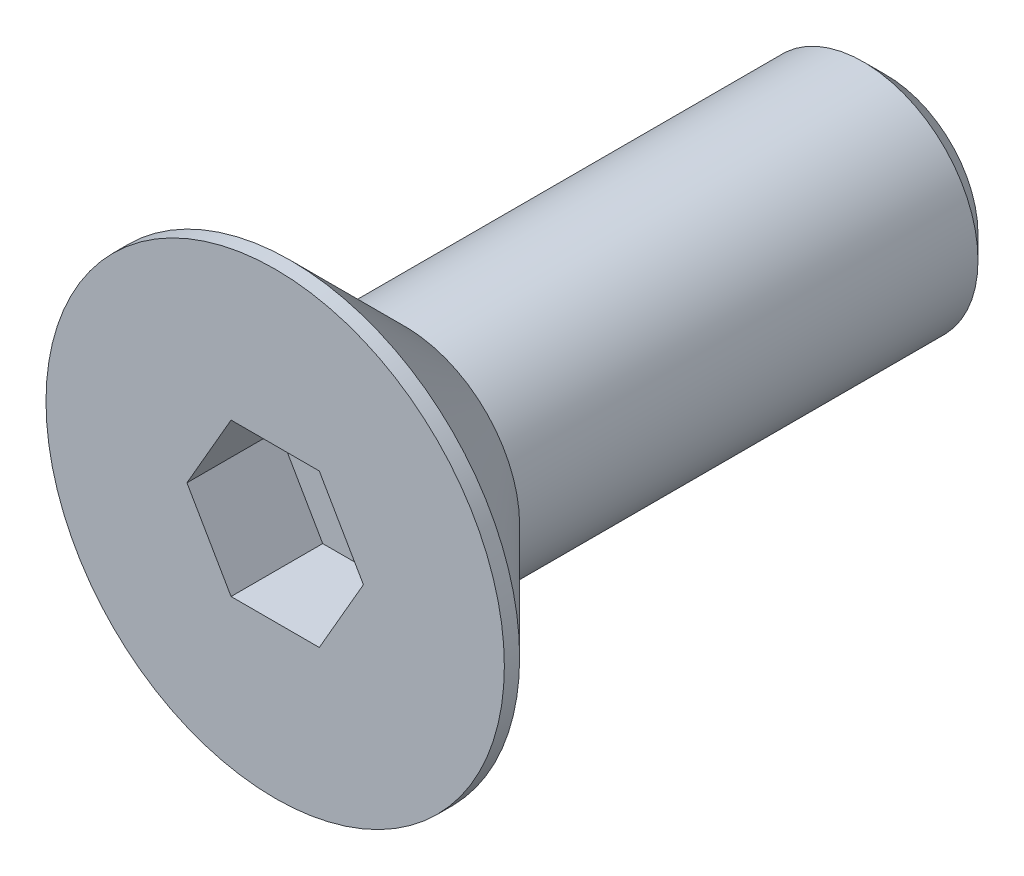
ISO-10303-21;
HEADER;
FILE_DESCRIPTION(('STEP AP214'),'2;1');
FILE_NAME('part.step','',(''),(''),'','','');
FILE_SCHEMA(('AUTOMOTIVE_DESIGN { 1 0 10303 214 1 1 1 1 }'));
ENDSEC;
DATA;
#1=APPLICATION_CONTEXT('core data for automotive mechanical design processes');
#2=APPLICATION_PROTOCOL_DEFINITION('international standard','automotive_design',2000,#1);
#3=PRODUCT_CONTEXT('',#1,'mechanical');
#4=PRODUCT('Part','Part','',(#3));
#5=PRODUCT_RELATED_PRODUCT_CATEGORY('part','',(#4));
#6=PRODUCT_DEFINITION_FORMATION('','',#4);
#7=PRODUCT_DEFINITION_CONTEXT('part definition',#1,'design');
#8=PRODUCT_DEFINITION('design','',#6,#7);
#9=PRODUCT_DEFINITION_SHAPE('','',#8);
#10=(LENGTH_UNIT() NAMED_UNIT(*) SI_UNIT(.MILLI.,.METRE.));
#11=(NAMED_UNIT(*) PLANE_ANGLE_UNIT() SI_UNIT($,.RADIAN.));
#12=(NAMED_UNIT(*) SI_UNIT($,.STERADIAN.) SOLID_ANGLE_UNIT());
#13=UNCERTAINTY_MEASURE_WITH_UNIT(LENGTH_MEASURE(1.E-05),#10,'distance_accuracy_value','');
#14=(GEOMETRIC_REPRESENTATION_CONTEXT(3) GLOBAL_UNCERTAINTY_ASSIGNED_CONTEXT((#13)) GLOBAL_UNIT_ASSIGNED_CONTEXT((#10,
#11,#12)) REPRESENTATION_CONTEXT('',''));
#15=CARTESIAN_POINT('',(0.,0.,0.));
#16=DIRECTION('',(0.,0.,1.));
#17=DIRECTION('',(1.,0.,0.));
#18=AXIS2_PLACEMENT_3D('',#15,#16,#17);
#19=CARTESIAN_POINT('',(0.,0.,-6.3));
#20=DIRECTION('',(0.,0.,1.));
#21=DIRECTION('',(1.,0.,0.));
#22=AXIS2_PLACEMENT_3D('',#19,#20,#21);
#23=PLANE('',#22);
#24=CARTESIAN_POINT('',(0.,0.,-6.3));
#25=DIRECTION('',(0.,0.,1.));
#26=DIRECTION('',(1.,0.,0.));
#27=AXIS2_PLACEMENT_3D('',#24,#25,#26);
#28=CIRCLE('',#27,1.2);
#29=CARTESIAN_POINT('',(1.2,0.,-6.3));
#30=VERTEX_POINT('',#29);
#31=EDGE_CURVE('E25',#30,#30,#28,.T.);
#32=ORIENTED_EDGE('',*,*,#31,.F.);
#33=EDGE_LOOP('',(#32));
#34=FACE_BOUND('',#33,.T.);
#35=ADVANCED_FACE('F16',(#34),#23,.F.);
#36=CARTESIAN_POINT('',(0.,0.,-6.3));
#37=DIRECTION('',(0.,0.,1.));
#38=DIRECTION('',(1.,0.,0.));
#39=AXIS2_PLACEMENT_3D('',#36,#37,#38);
#40=CONICAL_SURFACE('',#39,1.2,0.785398163397);
#41=ORIENTED_EDGE('',*,*,#31,.T.);
#42=DIRECTION('',(0.707106781186548,0.,0.707106781186548));
#43=VECTOR('',#42,1.);
#44=CARTESIAN_POINT('',(1.2,0.,-6.3));
#45=LINE('',#44,#43);
#46=CARTESIAN_POINT('',(1.5,0.,-6.));
#47=VERTEX_POINT('',#46);
#48=EDGE_CURVE('E11',#30,#47,#45,.T.);
#49=ORIENTED_EDGE('',*,*,#48,.T.);
#50=CARTESIAN_POINT('',(0.,0.,-6.));
#51=DIRECTION('',(0.,0.,1.));
#52=DIRECTION('',(1.,0.,0.));
#53=AXIS2_PLACEMENT_3D('',#50,#51,#52);
#54=CIRCLE('',#53,1.5);
#55=EDGE_CURVE('E105',#47,#47,#54,.T.);
#56=ORIENTED_EDGE('',*,*,#55,.F.);
#57=ORIENTED_EDGE('',*,*,#48,.F.);
#58=EDGE_LOOP('',(#41,#49,#56,#57));
#59=FACE_BOUND('',#58,.T.);
#60=ADVANCED_FACE('F127',(#59),#40,.T.);
#61=CARTESIAN_POINT('',(0.,0.,-6.));
#62=DIRECTION('',(0.,0.,1.));
#63=DIRECTION('',(1.,0.,0.));
#64=AXIS2_PLACEMENT_3D('',#61,#62,#63);
#65=CYLINDRICAL_SURFACE('',#64,1.5);
#66=ORIENTED_EDGE('',*,*,#55,.T.);
#67=DIRECTION('',(0.,0.,1.));
#68=VECTOR('',#67,1.);
#69=CARTESIAN_POINT('',(1.5,0.,-6.));
#70=LINE('',#69,#68);
#71=CARTESIAN_POINT('',(1.5,0.,0.));
#72=VERTEX_POINT('',#71);
#73=EDGE_CURVE('E100',#47,#72,#70,.T.);
#74=ORIENTED_EDGE('',*,*,#73,.T.);
#75=CARTESIAN_POINT('',(0.,0.,0.));
#76=DIRECTION('',(0.,0.,1.));
#77=DIRECTION('',(1.,0.,0.));
#78=AXIS2_PLACEMENT_3D('',#75,#76,#77);
#79=CIRCLE('',#78,1.5);
#80=EDGE_CURVE('E103',#72,#72,#79,.T.);
#81=ORIENTED_EDGE('',*,*,#80,.F.);
#82=ORIENTED_EDGE('',*,*,#73,.F.);
#83=EDGE_LOOP('',(#66,#74,#81,#82));
#84=FACE_BOUND('',#83,.T.);
#85=ADVANCED_FACE('F102',(#84),#65,.T.);
#86=CARTESIAN_POINT('',(0.,0.,0.5));
#87=DIRECTION('',(0.,0.,1.));
#88=DIRECTION('',(1.,0.,0.));
#89=AXIS2_PLACEMENT_3D('',#86,#87,#88);
#90=PLANE('',#89);
#91=DIRECTION('',(-0.50000000000019,0.866025403784329,0.));
#92=VECTOR('',#91,1.);
#93=CARTESIAN_POINT('',(1.155,0.,0.5));
#94=LINE('',#93,#92);
#95=CARTESIAN_POINT('',(1.155,0.,0.5));
#96=VERTEX_POINT('',#95);
#97=CARTESIAN_POINT('',(0.5775,1.000259341371,0.5));
#98=VERTEX_POINT('',#97);
#99=EDGE_CURVE('E120',#96,#98,#94,.T.);
#100=ORIENTED_EDGE('',*,*,#99,.T.);
#101=DIRECTION('',(-1.,0.,0.));
#102=VECTOR('',#101,1.);
#103=CARTESIAN_POINT('',(0.5775,1.000259341371,0.5));
#104=LINE('',#103,#102);
#105=CARTESIAN_POINT('',(-0.5775,1.000259341371,0.5));
#106=VERTEX_POINT('',#105);
#107=EDGE_CURVE('E159',#98,#106,#104,.T.);
#108=ORIENTED_EDGE('',*,*,#107,.T.);
#109=DIRECTION('',(-0.50000000000019,-0.866025403784329,0.));
#110=VECTOR('',#109,1.);
#111=CARTESIAN_POINT('',(-0.5775,1.000259341371,0.5));
#112=LINE('',#111,#110);
#113=CARTESIAN_POINT('',(-1.155,0.,0.5));
#114=VERTEX_POINT('',#113);
#115=EDGE_CURVE('E176',#106,#114,#112,.T.);
#116=ORIENTED_EDGE('',*,*,#115,.T.);
#117=DIRECTION('',(0.50000000000019,-0.866025403784329,0.));
#118=VECTOR('',#117,1.);
#119=CARTESIAN_POINT('',(-1.155,0.,0.5));
#120=LINE('',#119,#118);
#121=CARTESIAN_POINT('',(-0.5775,-1.000259341371,0.5));
#122=VERTEX_POINT('',#121);
#123=EDGE_CURVE('E183',#114,#122,#120,.T.);
#124=ORIENTED_EDGE('',*,*,#123,.T.);
#125=DIRECTION('',(1.,0.,0.));
#126=VECTOR('',#125,1.);
#127=CARTESIAN_POINT('',(-0.5775,-1.000259341371,0.5));
#128=LINE('',#127,#126);
#129=CARTESIAN_POINT('',(0.5775,-1.000259341371,0.5));
#130=VERTEX_POINT('',#129);
#131=EDGE_CURVE('E187',#122,#130,#128,.T.);
#132=ORIENTED_EDGE('',*,*,#131,.T.);
#133=DIRECTION('',(0.50000000000019,0.866025403784329,0.));
#134=VECTOR('',#133,1.);
#135=CARTESIAN_POINT('',(0.5775,-1.000259341371,0.5));
#136=LINE('',#135,#134);
#137=EDGE_CURVE('E162',#130,#96,#136,.T.);
#138=ORIENTED_EDGE('',*,*,#137,.T.);
#139=EDGE_LOOP('',(#100,#108,#116,#124,#132,#138));
#140=FACE_BOUND('',#139,.T.);
#141=ADVANCED_FACE('F138',(#140),#90,.T.);
#142=CARTESIAN_POINT('',(0.,0.,1.5));
#143=DIRECTION('',(0.,0.,1.));
#144=DIRECTION('',(1.,0.,0.));
#145=AXIS2_PLACEMENT_3D('',#142,#143,#144);
#146=CONICAL_SURFACE('',#145,3.,0.785398163397);
#147=DIRECTION('',(-0.707106781186548,0.,-0.707106781186548));
#148=VECTOR('',#147,1.);
#149=CARTESIAN_POINT('',(3.,0.,1.5));
#150=LINE('',#149,#148);
#151=CARTESIAN_POINT('',(3.,0.,1.5));
#152=VERTEX_POINT('',#151);
#153=EDGE_CURVE('E111',#152,#72,#150,.T.);
#154=ORIENTED_EDGE('',*,*,#153,.T.);
#155=ORIENTED_EDGE('',*,*,#80,.T.);
#156=ORIENTED_EDGE('',*,*,#153,.F.);
#157=CARTESIAN_POINT('',(0.,0.,1.5));
#158=DIRECTION('',(0.,0.,1.));
#159=DIRECTION('',(1.,0.,0.));
#160=AXIS2_PLACEMENT_3D('',#157,#158,#159);
#161=CIRCLE('',#160,3.);
#162=EDGE_CURVE('E197',#152,#152,#161,.T.);
#163=ORIENTED_EDGE('',*,*,#162,.F.);
#164=EDGE_LOOP('',(#154,#155,#156,#163));
#165=FACE_BOUND('',#164,.T.);
#166=ADVANCED_FACE('F109',(#165),#146,.T.);
#167=CARTESIAN_POINT('',(1.155,0.,0.5));
#168=DIRECTION('',(-0.866025403784329,-0.50000000000019,0.));
#169=DIRECTION('',(-0.50000000000019,0.866025403784329,0.));
#170=AXIS2_PLACEMENT_3D('',#167,#168,#169);
#171=PLANE('',#170);
#172=DIRECTION('',(0.,0.,1.));
#173=VECTOR('',#172,1.);
#174=CARTESIAN_POINT('',(1.155,0.,0.5));
#175=LINE('',#174,#173);
#176=CARTESIAN_POINT('',(1.155,0.,1.7));
#177=VERTEX_POINT('',#176);
#178=EDGE_CURVE('E196',#96,#177,#175,.T.);
#179=ORIENTED_EDGE('',*,*,#178,.T.);
#180=DIRECTION('',(-0.50000000000019,0.866025403784329,0.));
#181=VECTOR('',#180,1.);
#182=CARTESIAN_POINT('',(1.155,0.,1.7));
#183=LINE('',#182,#181);
#184=CARTESIAN_POINT('',(0.5775,1.000259341371,1.7));
#185=VERTEX_POINT('',#184);
#186=EDGE_CURVE('E173',#177,#185,#183,.T.);
#187=ORIENTED_EDGE('',*,*,#186,.T.);
#188=DIRECTION('',(0.,0.,1.));
#189=VECTOR('',#188,1.);
#190=CARTESIAN_POINT('',(0.5775,1.000259341371,0.5));
#191=LINE('',#190,#189);
#192=EDGE_CURVE('E167',#98,#185,#191,.T.);
#193=ORIENTED_EDGE('',*,*,#192,.F.);
#194=ORIENTED_EDGE('',*,*,#99,.F.);
#195=EDGE_LOOP('',(#179,#187,#193,#194));
#196=FACE_BOUND('',#195,.T.);
#197=ADVANCED_FACE('F147',(#196),#171,.T.);
#198=CARTESIAN_POINT('',(0.5775,1.000259341371,0.5));
#199=DIRECTION('',(0.,-1.,0.));
#200=DIRECTION('',(-1.,0.,0.));
#201=AXIS2_PLACEMENT_3D('',#198,#199,#200);
#202=PLANE('',#201);
#203=ORIENTED_EDGE('',*,*,#192,.T.);
#204=DIRECTION('',(-1.,0.,0.));
#205=VECTOR('',#204,1.);
#206=CARTESIAN_POINT('',(0.5775,1.000259341371,1.7));
#207=LINE('',#206,#205);
#208=CARTESIAN_POINT('',(-0.5775,1.000259341371,1.7));
#209=VERTEX_POINT('',#208);
#210=EDGE_CURVE('E210',#185,#209,#207,.T.);
#211=ORIENTED_EDGE('',*,*,#210,.T.);
#212=DIRECTION('',(0.,0.,1.));
#213=VECTOR('',#212,1.);
#214=CARTESIAN_POINT('',(-0.5775,1.000259341371,0.5));
#215=LINE('',#214,#213);
#216=EDGE_CURVE('E169',#106,#209,#215,.T.);
#217=ORIENTED_EDGE('',*,*,#216,.F.);
#218=ORIENTED_EDGE('',*,*,#107,.F.);
#219=EDGE_LOOP('',(#203,#211,#217,#218));
#220=FACE_BOUND('',#219,.T.);
#221=ADVANCED_FACE('F144',(#220),#202,.T.);
#222=CARTESIAN_POINT('',(-0.5775,1.000259341371,0.5));
#223=DIRECTION('',(0.866025403784329,-0.50000000000019,0.));
#224=DIRECTION('',(0.,0.,-1.));
#225=AXIS2_PLACEMENT_3D('',#222,#223,#224);
#226=PLANE('',#225);
#227=ORIENTED_EDGE('',*,*,#216,.T.);
#228=DIRECTION('',(-0.50000000000019,-0.866025403784329,0.));
#229=VECTOR('',#228,1.);
#230=CARTESIAN_POINT('',(-0.5775,1.000259341371,1.7));
#231=LINE('',#230,#229);
#232=CARTESIAN_POINT('',(-1.155,0.,1.7));
#233=VERTEX_POINT('',#232);
#234=EDGE_CURVE('E213',#209,#233,#231,.T.);
#235=ORIENTED_EDGE('',*,*,#234,.T.);
#236=DIRECTION('',(0.,0.,1.));
#237=VECTOR('',#236,1.);
#238=CARTESIAN_POINT('',(-1.155,0.,0.5));
#239=LINE('',#238,#237);
#240=EDGE_CURVE('E184',#114,#233,#239,.T.);
#241=ORIENTED_EDGE('',*,*,#240,.F.);
#242=ORIENTED_EDGE('',*,*,#115,.F.);
#243=EDGE_LOOP('',(#227,#235,#241,#242));
#244=FACE_BOUND('',#243,.T.);
#245=ADVANCED_FACE('F142',(#244),#226,.T.);
#246=CARTESIAN_POINT('',(-1.155,0.,0.5));
#247=DIRECTION('',(0.866025403784329,0.50000000000019,0.));
#248=DIRECTION('',(0.,0.,-1.));
#249=AXIS2_PLACEMENT_3D('',#246,#247,#248);
#250=PLANE('',#249);
#251=ORIENTED_EDGE('',*,*,#240,.T.);
#252=DIRECTION('',(0.50000000000019,-0.866025403784329,0.));
#253=VECTOR('',#252,1.);
#254=CARTESIAN_POINT('',(-1.155,0.,1.7));
#255=LINE('',#254,#253);
#256=CARTESIAN_POINT('',(-0.5775,-1.000259341371,1.7));
#257=VERTEX_POINT('',#256);
#258=EDGE_CURVE('E219',#233,#257,#255,.T.);
#259=ORIENTED_EDGE('',*,*,#258,.T.);
#260=DIRECTION('',(0.,0.,1.));
#261=VECTOR('',#260,1.);
#262=CARTESIAN_POINT('',(-0.5775,-1.000259341371,0.5));
#263=LINE('',#262,#261);
#264=EDGE_CURVE('E190',#122,#257,#263,.T.);
#265=ORIENTED_EDGE('',*,*,#264,.F.);
#266=ORIENTED_EDGE('',*,*,#123,.F.);
#267=EDGE_LOOP('',(#251,#259,#265,#266));
#268=FACE_BOUND('',#267,.T.);
#269=ADVANCED_FACE('F254',(#268),#250,.T.);
#270=CARTESIAN_POINT('',(-0.5775,-1.000259341371,0.5));
#271=DIRECTION('',(0.,1.,0.));
#272=DIRECTION('',(1.,0.,0.));
#273=AXIS2_PLACEMENT_3D('',#270,#271,#272);
#274=PLANE('',#273);
#275=ORIENTED_EDGE('',*,*,#264,.T.);
#276=DIRECTION('',(1.,0.,0.));
#277=VECTOR('',#276,1.);
#278=CARTESIAN_POINT('',(-0.5775,-1.000259341371,1.7));
#279=LINE('',#278,#277);
#280=CARTESIAN_POINT('',(0.5775,-1.000259341371,1.7));
#281=VERTEX_POINT('',#280);
#282=EDGE_CURVE('E223',#257,#281,#279,.T.);
#283=ORIENTED_EDGE('',*,*,#282,.T.);
#284=DIRECTION('',(0.,0.,1.));
#285=VECTOR('',#284,1.);
#286=CARTESIAN_POINT('',(0.5775,-1.000259341371,0.5));
#287=LINE('',#286,#285);
#288=EDGE_CURVE('E193',#130,#281,#287,.T.);
#289=ORIENTED_EDGE('',*,*,#288,.F.);
#290=ORIENTED_EDGE('',*,*,#131,.F.);
#291=EDGE_LOOP('',(#275,#283,#289,#290));
#292=FACE_BOUND('',#291,.T.);
#293=ADVANCED_FACE('F249',(#292),#274,.T.);
#294=CARTESIAN_POINT('',(0.5775,-1.000259341371,0.5));
#295=DIRECTION('',(-0.866025403784329,0.50000000000019,0.));
#296=DIRECTION('',(0.,0.,1.));
#297=AXIS2_PLACEMENT_3D('',#294,#295,#296);
#298=PLANE('',#297);
#299=ORIENTED_EDGE('',*,*,#288,.T.);
#300=DIRECTION('',(0.50000000000019,0.866025403784329,0.));
#301=VECTOR('',#300,1.);
#302=CARTESIAN_POINT('',(0.5775,-1.000259341371,1.7));
#303=LINE('',#302,#301);
#304=EDGE_CURVE('E202',#281,#177,#303,.T.);
#305=ORIENTED_EDGE('',*,*,#304,.T.);
#306=ORIENTED_EDGE('',*,*,#178,.F.);
#307=ORIENTED_EDGE('',*,*,#137,.F.);
#308=EDGE_LOOP('',(#299,#305,#306,#307));
#309=FACE_BOUND('',#308,.T.);
#310=ADVANCED_FACE('F241',(#309),#298,.T.);
#311=CARTESIAN_POINT('',(0.,0.,1.7));
#312=DIRECTION('',(0.,0.,-1.));
#313=DIRECTION('',(1.,0.,0.));
#314=AXIS2_PLACEMENT_3D('',#311,#312,#313);
#315=CYLINDRICAL_SURFACE('',#314,3.);
#316=DIRECTION('',(0.,0.,-1.));
#317=VECTOR('',#316,1.);
#318=CARTESIAN_POINT('',(3.,0.,1.7));
#319=LINE('',#318,#317);
#320=CARTESIAN_POINT('',(3.,0.,1.7));
#321=VERTEX_POINT('',#320);
#322=EDGE_CURVE('E198',#321,#152,#319,.T.);
#323=ORIENTED_EDGE('',*,*,#322,.T.);
#324=ORIENTED_EDGE('',*,*,#162,.T.);
#325=ORIENTED_EDGE('',*,*,#322,.F.);
#326=CARTESIAN_POINT('',(0.,0.,1.7));
#327=DIRECTION('',(0.,0.,1.));
#328=DIRECTION('',(1.,0.,0.));
#329=AXIS2_PLACEMENT_3D('',#326,#327,#328);
#330=CIRCLE('',#329,3.);
#331=EDGE_CURVE('E231',#321,#321,#330,.T.);
#332=ORIENTED_EDGE('',*,*,#331,.F.);
#333=EDGE_LOOP('',(#323,#324,#325,#332));
#334=FACE_BOUND('',#333,.T.);
#335=ADVANCED_FACE('F239',(#334),#315,.T.);
#336=CARTESIAN_POINT('',(0.,0.,1.7));
#337=DIRECTION('',(0.,0.,1.));
#338=DIRECTION('',(1.,0.,0.));
#339=AXIS2_PLACEMENT_3D('',#336,#337,#338);
#340=PLANE('',#339);
#341=ORIENTED_EDGE('',*,*,#282,.F.);
#342=ORIENTED_EDGE('',*,*,#258,.F.);
#343=ORIENTED_EDGE('',*,*,#234,.F.);
#344=ORIENTED_EDGE('',*,*,#210,.F.);
#345=ORIENTED_EDGE('',*,*,#186,.F.);
#346=ORIENTED_EDGE('',*,*,#304,.F.);
#347=EDGE_LOOP('',(#341,#342,#343,#344,#345,#346));
#348=FACE_BOUND('',#347,.T.);
#349=ORIENTED_EDGE('',*,*,#331,.T.);
#350=EDGE_LOOP('',(#349));
#351=FACE_BOUND('',#350,.T.);
#352=ADVANCED_FACE('F237',(#348,#351),#340,.T.);
#353=CLOSED_SHELL('',(#35,#60,#85,#141,#166,#197,#221,#245,#269,#293,#310,#335,#352));
#354=MANIFOLD_SOLID_BREP('B1',#353);
#355=ADVANCED_BREP_SHAPE_REPRESENTATION('',(#18,#354),#14);
#356=SHAPE_DEFINITION_REPRESENTATION(#9,#355);
ENDSEC;
END-ISO-10303-21;
